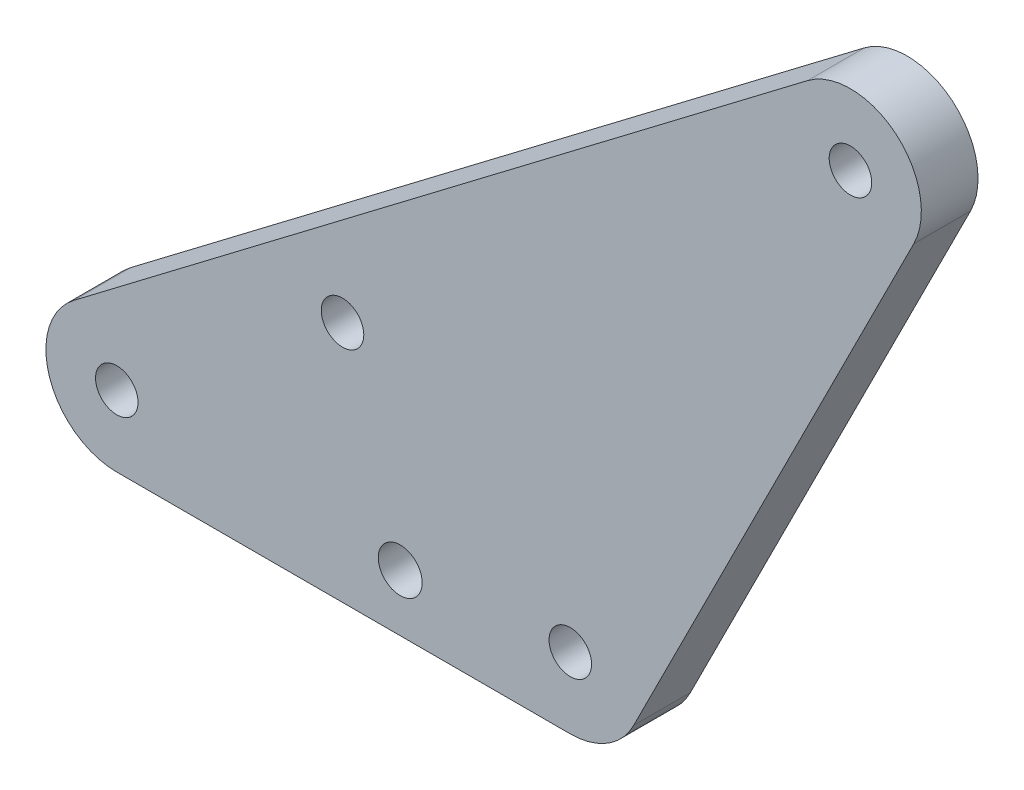
ISO-10303-21;
HEADER;
FILE_DESCRIPTION(('STEP AP214'),'2;1');
FILE_NAME('part.step','',(''),(''),'','','');
FILE_SCHEMA(('AUTOMOTIVE_DESIGN { 1 0 10303 214 1 1 1 1 }'));
ENDSEC;
DATA;
#1=APPLICATION_CONTEXT('core data for automotive mechanical design processes');
#2=APPLICATION_PROTOCOL_DEFINITION('international standard','automotive_design',2000,#1);
#3=PRODUCT_CONTEXT('',#1,'mechanical');
#4=PRODUCT('Part','Part','',(#3));
#5=PRODUCT_RELATED_PRODUCT_CATEGORY('part','',(#4));
#6=PRODUCT_DEFINITION_FORMATION('','',#4);
#7=PRODUCT_DEFINITION_CONTEXT('part definition',#1,'design');
#8=PRODUCT_DEFINITION('design','',#6,#7);
#9=PRODUCT_DEFINITION_SHAPE('','',#8);
#10=(LENGTH_UNIT() NAMED_UNIT(*) SI_UNIT(.MILLI.,.METRE.));
#11=(NAMED_UNIT(*) PLANE_ANGLE_UNIT() SI_UNIT($,.RADIAN.));
#12=(NAMED_UNIT(*) SI_UNIT($,.STERADIAN.) SOLID_ANGLE_UNIT());
#13=UNCERTAINTY_MEASURE_WITH_UNIT(LENGTH_MEASURE(1.E-05),#10,'distance_accuracy_value','');
#14=(GEOMETRIC_REPRESENTATION_CONTEXT(3) GLOBAL_UNCERTAINTY_ASSIGNED_CONTEXT((#13)) GLOBAL_UNIT_ASSIGNED_CONTEXT((#10,
#11,#12)) REPRESENTATION_CONTEXT('',''));
#15=CARTESIAN_POINT('',(0.,0.,0.));
#16=DIRECTION('',(0.,0.,1.));
#17=DIRECTION('',(1.,0.,0.));
#18=AXIS2_PLACEMENT_3D('',#15,#16,#17);
#19=CARTESIAN_POINT('',(-35.9153462137219,-14.2889011818033,4.));
#20=DIRECTION('',(0.,0.,-1.));
#21=DIRECTION('',(-1.,0.,0.));
#22=AXIS2_PLACEMENT_3D('',#19,#20,#21);
#23=PLANE('',#22);
#24=CARTESIAN_POINT('',(-35.9153462137219,-14.2889011818033,4.));
#25=DIRECTION('',(0.,0.,1.));
#26=DIRECTION('',(-1.,0.,0.));
#27=AXIS2_PLACEMENT_3D('',#24,#25,#26);
#28=CIRCLE('',#27,5.);
#29=CARTESIAN_POINT('',(-38.9392353866145,-10.3069300279572,4.));
#30=VERTEX_POINT('',#29);
#31=CARTESIAN_POINT('',(-35.9153462137218,-19.2889011818033,4.));
#32=VERTEX_POINT('',#31);
#33=EDGE_CURVE('E137',#30,#32,#28,.T.);
#34=ORIENTED_EDGE('',*,*,#33,.T.);
#35=DIRECTION('',(1.,0.,0.));
#36=VECTOR('',#35,1.);
#37=CARTESIAN_POINT('',(-35.9153462137218,-19.2889011818033,4.));
#38=LINE('',#37,#36);
#39=CARTESIAN_POINT('',(-3.91534621372194,-19.2889011818033,4.));
#40=VERTEX_POINT('',#39);
#41=EDGE_CURVE('E95',#32,#40,#38,.T.);
#42=ORIENTED_EDGE('',*,*,#41,.T.);
#43=CARTESIAN_POINT('',(-3.91534621372191,-14.2889011818033,4.));
#44=DIRECTION('',(0.,0.,1.));
#45=DIRECTION('',(1.,0.,0.));
#46=AXIS2_PLACEMENT_3D('',#43,#44,#45);
#47=CIRCLE('',#46,5.);
#48=CARTESIAN_POINT('',(0.551762791687617,-16.5349949318033,4.));
#49=VERTEX_POINT('',#48);
#50=EDGE_CURVE('E108',#40,#49,#47,.T.);
#51=ORIENTED_EDGE('',*,*,#50,.T.);
#52=DIRECTION('',(0.44921875,0.893421801081906,0.));
#53=VECTOR('',#52,1.);
#54=CARTESIAN_POINT('',(0.551762791687616,-16.5349949318033,4.));
#55=LINE('',#54,#53);
#56=CARTESIAN_POINT('',(20.3173877916876,22.7755643158006,4.));
#57=VERTEX_POINT('',#56);
#58=EDGE_CURVE('E102',#49,#57,#55,.T.);
#59=ORIENTED_EDGE('',*,*,#58,.T.);
#60=CARTESIAN_POINT('',(15.8502787862781,25.0216580658006,4.));
#61=DIRECTION('',(0.,0.,1.));
#62=DIRECTION('',(1.,0.,0.));
#63=AXIS2_PLACEMENT_3D('',#60,#61,#62);
#64=CIRCLE('',#63,5.);
#65=CARTESIAN_POINT('',(12.8263896133855,29.0036292196467,4.));
#66=VERTEX_POINT('',#65);
#67=EDGE_CURVE('E106',#57,#66,#64,.T.);
#68=ORIENTED_EDGE('',*,*,#67,.T.);
#69=DIRECTION('',(-0.796394230769231,-0.604777834578521,0.));
#70=VECTOR('',#69,1.);
#71=CARTESIAN_POINT('',(12.8263896133855,29.0036292196467,4.));
#72=LINE('',#71,#70);
#73=EDGE_CURVE('E58',#66,#30,#72,.T.);
#74=ORIENTED_EDGE('',*,*,#73,.T.);
#75=EDGE_LOOP('',(#34,#42,#51,#59,#68,#74));
#76=FACE_BOUND('',#75,.T.);
#77=CARTESIAN_POINT('',(15.8502787862781,25.0216580658006,4.));
#78=DIRECTION('',(0.,0.,1.));
#79=DIRECTION('',(1.,0.,0.));
#80=AXIS2_PLACEMENT_3D('',#77,#78,#79);
#81=CIRCLE('',#80,1.5);
#82=CARTESIAN_POINT('',(17.3502787862781,25.0216580658006,4.));
#83=VERTEX_POINT('',#82);
#84=EDGE_CURVE('E130',#83,#83,#81,.T.);
#85=ORIENTED_EDGE('',*,*,#84,.F.);
#86=EDGE_LOOP('',(#85));
#87=FACE_BOUND('',#86,.T.);
#88=CARTESIAN_POINT('',(-3.91534621372191,-14.2889011818033,4.));
#89=DIRECTION('',(0.,0.,1.));
#90=DIRECTION('',(1.,0.,0.));
#91=AXIS2_PLACEMENT_3D('',#88,#89,#90);
#92=CIRCLE('',#91,1.5);
#93=CARTESIAN_POINT('',(-2.41534621372191,-14.2889011818033,4.));
#94=VERTEX_POINT('',#93);
#95=EDGE_CURVE('E211',#94,#94,#92,.T.);
#96=ORIENTED_EDGE('',*,*,#95,.F.);
#97=EDGE_LOOP('',(#96));
#98=FACE_BOUND('',#97,.T.);
#99=CARTESIAN_POINT('',(-35.9153462137219,-14.2889011818033,4.));
#100=DIRECTION('',(0.,0.,1.));
#101=DIRECTION('',(1.,0.,0.));
#102=AXIS2_PLACEMENT_3D('',#99,#100,#101);
#103=CIRCLE('',#102,1.5);
#104=CARTESIAN_POINT('',(-34.4153462137219,-14.2889011818033,4.));
#105=VERTEX_POINT('',#104);
#106=EDGE_CURVE('E205',#105,#105,#103,.T.);
#107=ORIENTED_EDGE('',*,*,#106,.F.);
#108=EDGE_LOOP('',(#107));
#109=FACE_BOUND('',#108,.T.);
#110=CARTESIAN_POINT('',(-19.9874615983373,-2.19334449023291,4.));
#111=DIRECTION('',(0.,0.,1.));
#112=DIRECTION('',(1.,0.,0.));
#113=AXIS2_PLACEMENT_3D('',#110,#111,#112);
#114=CIRCLE('',#113,1.5);
#115=CARTESIAN_POINT('',(-18.4874615983373,-2.19334449023291,4.));
#116=VERTEX_POINT('',#115);
#117=EDGE_CURVE('E199',#116,#116,#114,.T.);
#118=ORIENTED_EDGE('',*,*,#117,.F.);
#119=EDGE_LOOP('',(#118));
#120=FACE_BOUND('',#119,.T.);
#121=CARTESIAN_POINT('',(-15.9153462137219,-15.2889011818033,4.));
#122=DIRECTION('',(0.,0.,1.));
#123=DIRECTION('',(1.,0.,0.));
#124=AXIS2_PLACEMENT_3D('',#121,#122,#123);
#125=CIRCLE('',#124,1.55);
#126=CARTESIAN_POINT('',(-14.3653462137219,-15.2889011818033,4.));
#127=VERTEX_POINT('',#126);
#128=EDGE_CURVE('E190',#127,#127,#125,.T.);
#129=ORIENTED_EDGE('',*,*,#128,.F.);
#130=EDGE_LOOP('',(#129));
#131=FACE_BOUND('',#130,.T.);
#132=ADVANCED_FACE('F41',(#76,#87,#98,#109,#120,#131),#23,.F.);
#133=CARTESIAN_POINT('',(-35.9153462137219,-14.2889011818033,0.));
#134=DIRECTION('',(0.,0.,-1.));
#135=DIRECTION('',(-1.,0.,0.));
#136=AXIS2_PLACEMENT_3D('',#133,#134,#135);
#137=PLANE('',#136);
#138=CARTESIAN_POINT('',(-19.9874615983373,-2.19334449023291,0.));
#139=DIRECTION('',(0.,0.,1.));
#140=DIRECTION('',(1.,0.,0.));
#141=AXIS2_PLACEMENT_3D('',#138,#139,#140);
#142=CIRCLE('',#141,1.5);
#143=CARTESIAN_POINT('',(-18.4874615983373,-2.19334449023291,0.));
#144=VERTEX_POINT('',#143);
#145=EDGE_CURVE('E196',#144,#144,#142,.T.);
#146=ORIENTED_EDGE('',*,*,#145,.T.);
#147=EDGE_LOOP('',(#146));
#148=FACE_BOUND('',#147,.T.);
#149=CARTESIAN_POINT('',(-3.91534621372191,-14.2889011818033,0.));
#150=DIRECTION('',(0.,0.,1.));
#151=DIRECTION('',(1.,0.,0.));
#152=AXIS2_PLACEMENT_3D('',#149,#150,#151);
#153=CIRCLE('',#152,1.5);
#154=CARTESIAN_POINT('',(-2.41534621372191,-14.2889011818033,0.));
#155=VERTEX_POINT('',#154);
#156=EDGE_CURVE('E208',#155,#155,#153,.T.);
#157=ORIENTED_EDGE('',*,*,#156,.T.);
#158=EDGE_LOOP('',(#157));
#159=FACE_BOUND('',#158,.T.);
#160=CARTESIAN_POINT('',(-35.9153462137219,-14.2889011818033,0.));
#161=DIRECTION('',(0.,0.,1.));
#162=DIRECTION('',(-1.,0.,0.));
#163=AXIS2_PLACEMENT_3D('',#160,#161,#162);
#164=CIRCLE('',#163,5.);
#165=CARTESIAN_POINT('',(-38.9392353866145,-10.3069300279572,0.));
#166=VERTEX_POINT('',#165);
#167=CARTESIAN_POINT('',(-35.9153462137218,-19.2889011818033,0.));
#168=VERTEX_POINT('',#167);
#169=EDGE_CURVE('E126',#166,#168,#164,.T.);
#170=ORIENTED_EDGE('',*,*,#169,.F.);
#171=DIRECTION('',(-0.796394230769231,-0.604777834578521,0.));
#172=VECTOR('',#171,1.);
#173=CARTESIAN_POINT('',(12.8263896133855,29.0036292196467,0.));
#174=LINE('',#173,#172);
#175=CARTESIAN_POINT('',(12.8263896133855,29.0036292196467,0.));
#176=VERTEX_POINT('',#175);
#177=EDGE_CURVE('E87',#176,#166,#174,.T.);
#178=ORIENTED_EDGE('',*,*,#177,.F.);
#179=CARTESIAN_POINT('',(15.8502787862781,25.0216580658006,0.));
#180=DIRECTION('',(0.,0.,1.));
#181=DIRECTION('',(1.,0.,0.));
#182=AXIS2_PLACEMENT_3D('',#179,#180,#181);
#183=CIRCLE('',#182,5.);
#184=CARTESIAN_POINT('',(20.3173877916876,22.7755643158006,0.));
#185=VERTEX_POINT('',#184);
#186=EDGE_CURVE('E81',#185,#176,#183,.T.);
#187=ORIENTED_EDGE('',*,*,#186,.F.);
#188=DIRECTION('',(0.44921875,0.893421801081906,0.));
#189=VECTOR('',#188,1.);
#190=CARTESIAN_POINT('',(0.551762791687616,-16.5349949318033,0.));
#191=LINE('',#190,#189);
#192=CARTESIAN_POINT('',(0.551762791687617,-16.5349949318033,0.));
#193=VERTEX_POINT('',#192);
#194=EDGE_CURVE('E116',#193,#185,#191,.T.);
#195=ORIENTED_EDGE('',*,*,#194,.F.);
#196=CARTESIAN_POINT('',(-3.91534621372191,-14.2889011818033,0.));
#197=DIRECTION('',(0.,0.,1.));
#198=DIRECTION('',(1.,0.,0.));
#199=AXIS2_PLACEMENT_3D('',#196,#197,#198);
#200=CIRCLE('',#199,5.);
#201=CARTESIAN_POINT('',(-3.91534621372194,-19.2889011818033,0.));
#202=VERTEX_POINT('',#201);
#203=EDGE_CURVE('E132',#202,#193,#200,.T.);
#204=ORIENTED_EDGE('',*,*,#203,.F.);
#205=DIRECTION('',(1.,0.,0.));
#206=VECTOR('',#205,1.);
#207=CARTESIAN_POINT('',(-35.9153462137218,-19.2889011818033,0.));
#208=LINE('',#207,#206);
#209=EDGE_CURVE('E129',#168,#202,#208,.T.);
#210=ORIENTED_EDGE('',*,*,#209,.F.);
#211=EDGE_LOOP('',(#170,#178,#187,#195,#204,#210));
#212=FACE_BOUND('',#211,.T.);
#213=CARTESIAN_POINT('',(15.8502787862781,25.0216580658006,0.));
#214=DIRECTION('',(0.,0.,1.));
#215=DIRECTION('',(1.,0.,0.));
#216=AXIS2_PLACEMENT_3D('',#213,#214,#215);
#217=CIRCLE('',#216,1.5);
#218=CARTESIAN_POINT('',(17.3502787862781,25.0216580658006,0.));
#219=VERTEX_POINT('',#218);
#220=EDGE_CURVE('E214',#219,#219,#217,.T.);
#221=ORIENTED_EDGE('',*,*,#220,.T.);
#222=EDGE_LOOP('',(#221));
#223=FACE_BOUND('',#222,.T.);
#224=CARTESIAN_POINT('',(-35.9153462137219,-14.2889011818033,0.));
#225=DIRECTION('',(0.,0.,1.));
#226=DIRECTION('',(1.,0.,0.));
#227=AXIS2_PLACEMENT_3D('',#224,#225,#226);
#228=CIRCLE('',#227,1.5);
#229=CARTESIAN_POINT('',(-34.4153462137219,-14.2889011818033,0.));
#230=VERTEX_POINT('',#229);
#231=EDGE_CURVE('E202',#230,#230,#228,.T.);
#232=ORIENTED_EDGE('',*,*,#231,.T.);
#233=EDGE_LOOP('',(#232));
#234=FACE_BOUND('',#233,.T.);
#235=CARTESIAN_POINT('',(-15.9153462137219,-15.2889011818033,0.));
#236=DIRECTION('',(0.,0.,1.));
#237=DIRECTION('',(1.,0.,0.));
#238=AXIS2_PLACEMENT_3D('',#235,#236,#237);
#239=CIRCLE('',#238,1.55);
#240=CARTESIAN_POINT('',(-14.3653462137219,-15.2889011818033,0.));
#241=VERTEX_POINT('',#240);
#242=EDGE_CURVE('E193',#241,#241,#239,.T.);
#243=ORIENTED_EDGE('',*,*,#242,.T.);
#244=EDGE_LOOP('',(#243));
#245=FACE_BOUND('',#244,.T.);
#246=ADVANCED_FACE('F146',(#148,#159,#212,#223,#234,#245),#137,.T.);
#247=CARTESIAN_POINT('',(-35.9153462137219,-14.2889011818033,4.));
#248=DIRECTION('',(0.,0.,-1.));
#249=DIRECTION('',(-1.,0.,0.));
#250=AXIS2_PLACEMENT_3D('',#247,#248,#249);
#251=CYLINDRICAL_SURFACE('',#250,5.);
#252=ORIENTED_EDGE('',*,*,#169,.T.);
#253=DIRECTION('',(0.,0.,-1.));
#254=VECTOR('',#253,1.);
#255=CARTESIAN_POINT('',(-35.9153462137218,-19.2889011818033,4.));
#256=LINE('',#255,#254);
#257=EDGE_CURVE('E11',#32,#168,#256,.T.);
#258=ORIENTED_EDGE('',*,*,#257,.F.);
#259=ORIENTED_EDGE('',*,*,#33,.F.);
#260=DIRECTION('',(0.,0.,-1.));
#261=VECTOR('',#260,1.);
#262=CARTESIAN_POINT('',(-38.9392353866145,-10.3069300279572,4.));
#263=LINE('',#262,#261);
#264=EDGE_CURVE('E122',#30,#166,#263,.T.);
#265=ORIENTED_EDGE('',*,*,#264,.T.);
#266=EDGE_LOOP('',(#252,#258,#259,#265));
#267=FACE_BOUND('',#266,.T.);
#268=ADVANCED_FACE('F43',(#267),#251,.T.);
#269=CARTESIAN_POINT('',(-35.9153462137218,-19.2889011818033,4.));
#270=DIRECTION('',(0.,1.,0.));
#271=DIRECTION('',(0.,0.,1.));
#272=AXIS2_PLACEMENT_3D('',#269,#270,#271);
#273=PLANE('',#272);
#274=ORIENTED_EDGE('',*,*,#209,.T.);
#275=DIRECTION('',(0.,0.,-1.));
#276=VECTOR('',#275,1.);
#277=CARTESIAN_POINT('',(-3.91534621372194,-19.2889011818033,4.));
#278=LINE('',#277,#276);
#279=EDGE_CURVE('E50',#40,#202,#278,.T.);
#280=ORIENTED_EDGE('',*,*,#279,.F.);
#281=ORIENTED_EDGE('',*,*,#41,.F.);
#282=ORIENTED_EDGE('',*,*,#257,.T.);
#283=EDGE_LOOP('',(#274,#280,#281,#282));
#284=FACE_BOUND('',#283,.T.);
#285=ADVANCED_FACE('F288',(#284),#273,.F.);
#286=CARTESIAN_POINT('',(-3.91534621372191,-14.2889011818033,4.));
#287=DIRECTION('',(0.,0.,-1.));
#288=DIRECTION('',(-1.,0.,0.));
#289=AXIS2_PLACEMENT_3D('',#286,#287,#288);
#290=CYLINDRICAL_SURFACE('',#289,5.);
#291=ORIENTED_EDGE('',*,*,#203,.T.);
#292=DIRECTION('',(0.,0.,-1.));
#293=VECTOR('',#292,1.);
#294=CARTESIAN_POINT('',(0.551762791687617,-16.5349949318033,4.));
#295=LINE('',#294,#293);
#296=EDGE_CURVE('E117',#49,#193,#295,.T.);
#297=ORIENTED_EDGE('',*,*,#296,.F.);
#298=ORIENTED_EDGE('',*,*,#50,.F.);
#299=ORIENTED_EDGE('',*,*,#279,.T.);
#300=EDGE_LOOP('',(#291,#297,#298,#299));
#301=FACE_BOUND('',#300,.T.);
#302=ADVANCED_FACE('F143',(#301),#290,.T.);
#303=CARTESIAN_POINT('',(0.551762791687616,-16.5349949318033,4.));
#304=DIRECTION('',(-0.893421801081906,0.44921875,0.));
#305=DIRECTION('',(-0.44921875,-0.893421801081906,0.));
#306=AXIS2_PLACEMENT_3D('',#303,#304,#305);
#307=PLANE('',#306);
#308=ORIENTED_EDGE('',*,*,#194,.T.);
#309=DIRECTION('',(0.,0.,-1.));
#310=VECTOR('',#309,1.);
#311=CARTESIAN_POINT('',(20.3173877916876,22.7755643158006,4.));
#312=LINE('',#311,#310);
#313=EDGE_CURVE('E113',#57,#185,#312,.T.);
#314=ORIENTED_EDGE('',*,*,#313,.F.);
#315=ORIENTED_EDGE('',*,*,#58,.F.);
#316=ORIENTED_EDGE('',*,*,#296,.T.);
#317=EDGE_LOOP('',(#308,#314,#315,#316));
#318=FACE_BOUND('',#317,.T.);
#319=ADVANCED_FACE('F114',(#318),#307,.F.);
#320=CARTESIAN_POINT('',(15.8502787862781,25.0216580658006,4.));
#321=DIRECTION('',(0.,0.,-1.));
#322=DIRECTION('',(-1.,0.,0.));
#323=AXIS2_PLACEMENT_3D('',#320,#321,#322);
#324=CYLINDRICAL_SURFACE('',#323,5.);
#325=ORIENTED_EDGE('',*,*,#186,.T.);
#326=DIRECTION('',(0.,0.,-1.));
#327=VECTOR('',#326,1.);
#328=CARTESIAN_POINT('',(12.8263896133855,29.0036292196467,4.));
#329=LINE('',#328,#327);
#330=EDGE_CURVE('E118',#66,#176,#329,.T.);
#331=ORIENTED_EDGE('',*,*,#330,.F.);
#332=ORIENTED_EDGE('',*,*,#67,.F.);
#333=ORIENTED_EDGE('',*,*,#313,.T.);
#334=EDGE_LOOP('',(#325,#331,#332,#333));
#335=FACE_BOUND('',#334,.T.);
#336=ADVANCED_FACE('F120',(#335),#324,.T.);
#337=CARTESIAN_POINT('',(12.8263896133855,29.0036292196467,4.));
#338=DIRECTION('',(0.604777834578521,-0.796394230769231,0.));
#339=DIRECTION('',(0.796394230769231,0.604777834578521,0.));
#340=AXIS2_PLACEMENT_3D('',#337,#338,#339);
#341=PLANE('',#340);
#342=ORIENTED_EDGE('',*,*,#177,.T.);
#343=ORIENTED_EDGE('',*,*,#264,.F.);
#344=ORIENTED_EDGE('',*,*,#73,.F.);
#345=ORIENTED_EDGE('',*,*,#330,.T.);
#346=EDGE_LOOP('',(#342,#343,#344,#345));
#347=FACE_BOUND('',#346,.T.);
#348=ADVANCED_FACE('F151',(#347),#341,.F.);
#349=CARTESIAN_POINT('',(15.8502787862781,25.0216580658006,4.));
#350=DIRECTION('',(0.,0.,-1.));
#351=DIRECTION('',(-1.,0.,0.));
#352=AXIS2_PLACEMENT_3D('',#349,#350,#351);
#353=CYLINDRICAL_SURFACE('',#352,1.5);
#354=ORIENTED_EDGE('',*,*,#84,.T.);
#355=EDGE_LOOP('',(#354));
#356=FACE_BOUND('',#355,.T.);
#357=ORIENTED_EDGE('',*,*,#220,.F.);
#358=EDGE_LOOP('',(#357));
#359=FACE_BOUND('',#358,.T.);
#360=ADVANCED_FACE('F153',(#356,#359),#353,.F.);
#361=CARTESIAN_POINT('',(-3.91534621372191,-14.2889011818033,4.));
#362=DIRECTION('',(0.,0.,-1.));
#363=DIRECTION('',(-1.,0.,0.));
#364=AXIS2_PLACEMENT_3D('',#361,#362,#363);
#365=CYLINDRICAL_SURFACE('',#364,1.5);
#366=ORIENTED_EDGE('',*,*,#95,.T.);
#367=EDGE_LOOP('',(#366));
#368=FACE_BOUND('',#367,.T.);
#369=ORIENTED_EDGE('',*,*,#156,.F.);
#370=EDGE_LOOP('',(#369));
#371=FACE_BOUND('',#370,.T.);
#372=ADVANCED_FACE('F159',(#368,#371),#365,.F.);
#373=CARTESIAN_POINT('',(-35.9153462137219,-14.2889011818033,4.));
#374=DIRECTION('',(0.,0.,-1.));
#375=DIRECTION('',(-1.,0.,0.));
#376=AXIS2_PLACEMENT_3D('',#373,#374,#375);
#377=CYLINDRICAL_SURFACE('',#376,1.5);
#378=ORIENTED_EDGE('',*,*,#106,.T.);
#379=EDGE_LOOP('',(#378));
#380=FACE_BOUND('',#379,.T.);
#381=ORIENTED_EDGE('',*,*,#231,.F.);
#382=EDGE_LOOP('',(#381));
#383=FACE_BOUND('',#382,.T.);
#384=ADVANCED_FACE('F173',(#380,#383),#377,.F.);
#385=CARTESIAN_POINT('',(-19.9874615983373,-2.19334449023291,4.));
#386=DIRECTION('',(0.,0.,-1.));
#387=DIRECTION('',(-1.,0.,0.));
#388=AXIS2_PLACEMENT_3D('',#385,#386,#387);
#389=CYLINDRICAL_SURFACE('',#388,1.5);
#390=ORIENTED_EDGE('',*,*,#117,.T.);
#391=EDGE_LOOP('',(#390));
#392=FACE_BOUND('',#391,.T.);
#393=ORIENTED_EDGE('',*,*,#145,.F.);
#394=EDGE_LOOP('',(#393));
#395=FACE_BOUND('',#394,.T.);
#396=ADVANCED_FACE('F177',(#392,#395),#389,.F.);
#397=CARTESIAN_POINT('',(-15.9153462137219,-15.2889011818033,4.));
#398=DIRECTION('',(0.,0.,-1.));
#399=DIRECTION('',(-1.,0.,0.));
#400=AXIS2_PLACEMENT_3D('',#397,#398,#399);
#401=CYLINDRICAL_SURFACE('',#400,1.55);
#402=ORIENTED_EDGE('',*,*,#128,.T.);
#403=EDGE_LOOP('',(#402));
#404=FACE_BOUND('',#403,.T.);
#405=ORIENTED_EDGE('',*,*,#242,.F.);
#406=EDGE_LOOP('',(#405));
#407=FACE_BOUND('',#406,.T.);
#408=ADVANCED_FACE('F181',(#404,#407),#401,.F.);
#409=CLOSED_SHELL('',(#132,#246,#268,#285,#302,#319,#336,#348,#360,#372,#384,#396,#408));
#410=MANIFOLD_SOLID_BREP('B2',#409);
#411=ADVANCED_BREP_SHAPE_REPRESENTATION('',(#18,#410),#14);
#412=SHAPE_DEFINITION_REPRESENTATION(#9,#411);
ENDSEC;
END-ISO-10303-21;
